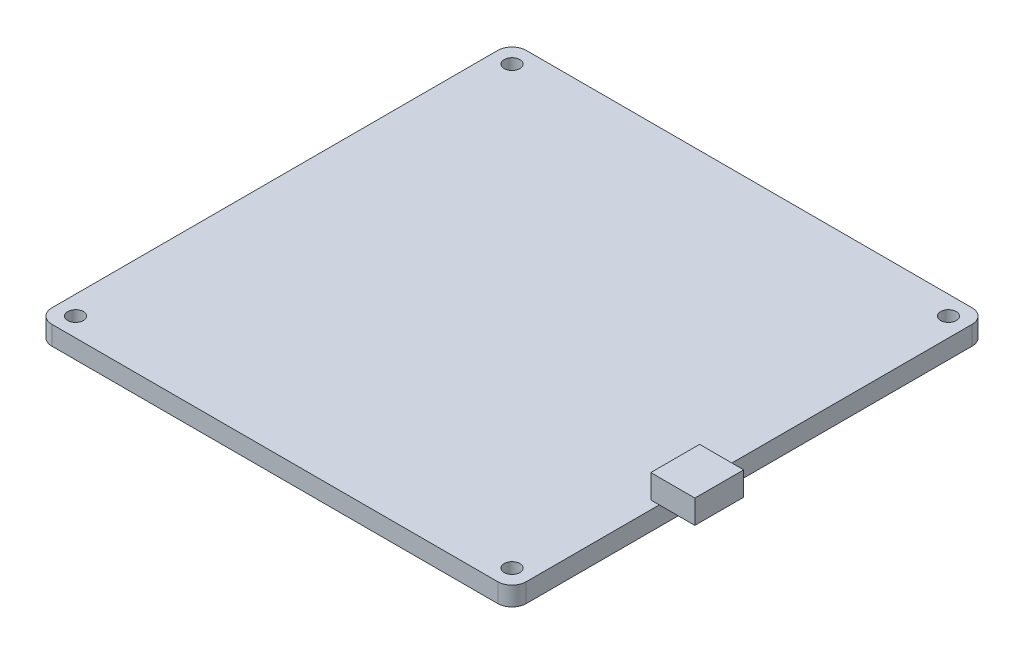
ISO-10303-21;
HEADER;
FILE_DESCRIPTION(('STEP AP214'),'2;1');
FILE_NAME('part.step','',(''),(''),'','','');
FILE_SCHEMA(('AUTOMOTIVE_DESIGN { 1 0 10303 214 1 1 1 1 }'));
ENDSEC;
DATA;
#1=APPLICATION_CONTEXT('core data for automotive mechanical design processes');
#2=APPLICATION_PROTOCOL_DEFINITION('international standard','automotive_design',2000,#1);
#3=PRODUCT_CONTEXT('',#1,'mechanical');
#4=PRODUCT('Part','Part','',(#3));
#5=PRODUCT_RELATED_PRODUCT_CATEGORY('part','',(#4));
#6=PRODUCT_DEFINITION_FORMATION('','',#4);
#7=PRODUCT_DEFINITION_CONTEXT('part definition',#1,'design');
#8=PRODUCT_DEFINITION('design','',#6,#7);
#9=PRODUCT_DEFINITION_SHAPE('','',#8);
#10=(LENGTH_UNIT() NAMED_UNIT(*) SI_UNIT(.MILLI.,.METRE.));
#11=(NAMED_UNIT(*) PLANE_ANGLE_UNIT() SI_UNIT($,.RADIAN.));
#12=(NAMED_UNIT(*) SI_UNIT($,.STERADIAN.) SOLID_ANGLE_UNIT());
#13=UNCERTAINTY_MEASURE_WITH_UNIT(LENGTH_MEASURE(1.E-05),#10,'distance_accuracy_value','');
#14=(GEOMETRIC_REPRESENTATION_CONTEXT(3) GLOBAL_UNCERTAINTY_ASSIGNED_CONTEXT((#13)) GLOBAL_UNIT_ASSIGNED_CONTEXT((#10,
#11,#12)) REPRESENTATION_CONTEXT('',''));
#15=CARTESIAN_POINT('',(0.,0.,0.));
#16=DIRECTION('',(0.,0.,1.));
#17=DIRECTION('',(1.,0.,0.));
#18=AXIS2_PLACEMENT_3D('',#15,#16,#17);
#19=CARTESIAN_POINT('',(0.,4.,0.));
#20=DIRECTION('',(0.,1.,0.));
#21=DIRECTION('',(0.,0.,1.));
#22=AXIS2_PLACEMENT_3D('',#19,#20,#21);
#23=PLANE('',#22);
#24=DIRECTION('',(1.,0.,0.));
#25=VECTOR('',#24,1.);
#26=CARTESIAN_POINT('',(48.2,4.,18.95));
#27=LINE('',#26,#25);
#28=CARTESIAN_POINT('',(48.2,4.,18.95));
#29=VERTEX_POINT('',#28);
#30=CARTESIAN_POINT('',(50.,4.,18.95));
#31=VERTEX_POINT('',#30);
#32=EDGE_CURVE('E58',#29,#31,#27,.T.);
#33=ORIENTED_EDGE('',*,*,#32,.F.);
#34=DIRECTION('',(0.,0.,1.));
#35=VECTOR('',#34,1.);
#36=CARTESIAN_POINT('',(48.2,4.,8.64999999999999));
#37=LINE('',#36,#35);
#38=CARTESIAN_POINT('',(48.2,4.,8.64999999999999));
#39=VERTEX_POINT('',#38);
#40=EDGE_CURVE('E284',#39,#29,#37,.T.);
#41=ORIENTED_EDGE('',*,*,#40,.F.);
#42=DIRECTION('',(-1.,0.,0.));
#43=VECTOR('',#42,1.);
#44=CARTESIAN_POINT('',(48.2,4.,8.64999999999999));
#45=LINE('',#44,#43);
#46=CARTESIAN_POINT('',(50.,4.,8.64999999999999));
#47=VERTEX_POINT('',#46);
#48=EDGE_CURVE('E11',#47,#39,#45,.T.);
#49=ORIENTED_EDGE('',*,*,#48,.F.);
#50=DIRECTION('',(0.,0.,-1.));
#51=VECTOR('',#50,1.);
#52=CARTESIAN_POINT('',(50.,4.,-50.));
#53=LINE('',#52,#51);
#54=CARTESIAN_POINT('',(50.,4.,-47.));
#55=VERTEX_POINT('',#54);
#56=EDGE_CURVE('E195',#47,#55,#53,.T.);
#57=ORIENTED_EDGE('',*,*,#56,.T.);
#58=CARTESIAN_POINT('',(47.,4.,-47.));
#59=DIRECTION('',(0.,1.,0.));
#60=DIRECTION('',(0.,0.,1.));
#61=AXIS2_PLACEMENT_3D('',#58,#59,#60);
#62=CIRCLE('',#61,3.);
#63=CARTESIAN_POINT('',(47.,4.,-50.));
#64=VERTEX_POINT('',#63);
#65=EDGE_CURVE('E240',#55,#64,#62,.T.);
#66=ORIENTED_EDGE('',*,*,#65,.T.);
#67=DIRECTION('',(-1.,0.,0.));
#68=VECTOR('',#67,1.);
#69=CARTESIAN_POINT('',(-50.,4.,-50.));
#70=LINE('',#69,#68);
#71=CARTESIAN_POINT('',(-47.,4.,-50.));
#72=VERTEX_POINT('',#71);
#73=EDGE_CURVE('E193',#64,#72,#70,.T.);
#74=ORIENTED_EDGE('',*,*,#73,.T.);
#75=CARTESIAN_POINT('',(-47.,4.,-47.));
#76=DIRECTION('',(0.,1.,0.));
#77=DIRECTION('',(0.,0.,1.));
#78=AXIS2_PLACEMENT_3D('',#75,#76,#77);
#79=CIRCLE('',#78,3.);
#80=CARTESIAN_POINT('',(-50.,4.,-47.));
#81=VERTEX_POINT('',#80);
#82=EDGE_CURVE('E234',#72,#81,#79,.T.);
#83=ORIENTED_EDGE('',*,*,#82,.T.);
#84=DIRECTION('',(0.,0.,1.));
#85=VECTOR('',#84,1.);
#86=CARTESIAN_POINT('',(-50.,4.,-50.));
#87=LINE('',#86,#85);
#88=CARTESIAN_POINT('',(-50.,4.,47.));
#89=VERTEX_POINT('',#88);
#90=EDGE_CURVE('E198',#81,#89,#87,.T.);
#91=ORIENTED_EDGE('',*,*,#90,.T.);
#92=CARTESIAN_POINT('',(-47.,4.,47.));
#93=DIRECTION('',(0.,1.,0.));
#94=DIRECTION('',(0.,0.,1.));
#95=AXIS2_PLACEMENT_3D('',#92,#93,#94);
#96=CIRCLE('',#95,3.);
#97=CARTESIAN_POINT('',(-47.,4.,50.));
#98=VERTEX_POINT('',#97);
#99=EDGE_CURVE('E236',#89,#98,#96,.T.);
#100=ORIENTED_EDGE('',*,*,#99,.T.);
#101=DIRECTION('',(1.,0.,0.));
#102=VECTOR('',#101,1.);
#103=CARTESIAN_POINT('',(-50.,4.,50.));
#104=LINE('',#103,#102);
#105=CARTESIAN_POINT('',(47.,4.,50.));
#106=VERTEX_POINT('',#105);
#107=EDGE_CURVE('E201',#98,#106,#104,.T.);
#108=ORIENTED_EDGE('',*,*,#107,.T.);
#109=CARTESIAN_POINT('',(47.,4.,47.));
#110=DIRECTION('',(0.,1.,0.));
#111=DIRECTION('',(0.,0.,1.));
#112=AXIS2_PLACEMENT_3D('',#109,#110,#111);
#113=CIRCLE('',#112,3.);
#114=CARTESIAN_POINT('',(50.,4.,47.));
#115=VERTEX_POINT('',#114);
#116=EDGE_CURVE('E238',#106,#115,#113,.T.);
#117=ORIENTED_EDGE('',*,*,#116,.T.);
#118=EDGE_CURVE('E191',#115,#31,#53,.T.);
#119=ORIENTED_EDGE('',*,*,#118,.T.);
#120=EDGE_LOOP('',(#33,#41,#49,#57,#66,#74,#83,#91,#100,#108,#117,#119));
#121=FACE_BOUND('',#120,.T.);
#122=CARTESIAN_POINT('',(45.9999999999997,4.,46.0000000000003));
#123=DIRECTION('',(0.,1.,0.));
#124=DIRECTION('',(0.,0.,1.));
#125=AXIS2_PLACEMENT_3D('',#122,#123,#124);
#126=CIRCLE('',#125,1.65000000000001);
#127=CARTESIAN_POINT('',(45.9999999999997,4.,47.6500000000003));
#128=VERTEX_POINT('',#127);
#129=EDGE_CURVE('E173',#128,#128,#126,.T.);
#130=ORIENTED_EDGE('',*,*,#129,.F.);
#131=EDGE_LOOP('',(#130));
#132=FACE_BOUND('',#131,.T.);
#133=CARTESIAN_POINT('',(-46.,4.,-46.));
#134=DIRECTION('',(0.,1.,0.));
#135=DIRECTION('',(0.,0.,1.));
#136=AXIS2_PLACEMENT_3D('',#133,#134,#135);
#137=CIRCLE('',#136,1.65);
#138=CARTESIAN_POINT('',(-46.,4.,-44.35));
#139=VERTEX_POINT('',#138);
#140=EDGE_CURVE('E185',#139,#139,#137,.T.);
#141=ORIENTED_EDGE('',*,*,#140,.F.);
#142=EDGE_LOOP('',(#141));
#143=FACE_BOUND('',#142,.T.);
#144=CARTESIAN_POINT('',(46.0000000000002,4.,-45.9999999999999));
#145=DIRECTION('',(0.,1.,0.));
#146=DIRECTION('',(0.,0.,1.));
#147=AXIS2_PLACEMENT_3D('',#144,#145,#146);
#148=CIRCLE('',#147,1.65);
#149=CARTESIAN_POINT('',(46.0000000000002,4.,-44.3499999999999));
#150=VERTEX_POINT('',#149);
#151=EDGE_CURVE('E179',#150,#150,#148,.T.);
#152=ORIENTED_EDGE('',*,*,#151,.F.);
#153=EDGE_LOOP('',(#152));
#154=FACE_BOUND('',#153,.T.);
#155=CARTESIAN_POINT('',(-46.0000000000005,4.,45.9999999999995));
#156=DIRECTION('',(0.,1.,0.));
#157=DIRECTION('',(0.,0.,1.));
#158=AXIS2_PLACEMENT_3D('',#155,#156,#157);
#159=CIRCLE('',#158,1.65);
#160=CARTESIAN_POINT('',(-46.0000000000005,4.,47.6499999999995));
#161=VERTEX_POINT('',#160);
#162=EDGE_CURVE('E164',#161,#161,#159,.T.);
#163=ORIENTED_EDGE('',*,*,#162,.F.);
#164=EDGE_LOOP('',(#163));
#165=FACE_BOUND('',#164,.T.);
#166=ADVANCED_FACE('F41',(#121,#132,#143,#154,#165),#23,.T.);
#167=CARTESIAN_POINT('',(0.,0.,0.));
#168=DIRECTION('',(0.,1.,0.));
#169=DIRECTION('',(0.,0.,1.));
#170=AXIS2_PLACEMENT_3D('',#167,#168,#169);
#171=PLANE('',#170);
#172=DIRECTION('',(-1.,0.,0.));
#173=VECTOR('',#172,1.);
#174=CARTESIAN_POINT('',(-50.,0.,-50.));
#175=LINE('',#174,#173);
#176=CARTESIAN_POINT('',(47.,0.,-50.));
#177=VERTEX_POINT('',#176);
#178=CARTESIAN_POINT('',(-47.,0.,-50.));
#179=VERTEX_POINT('',#178);
#180=EDGE_CURVE('E207',#177,#179,#175,.T.);
#181=ORIENTED_EDGE('',*,*,#180,.F.);
#182=CARTESIAN_POINT('',(47.,0.,-47.));
#183=DIRECTION('',(0.,1.,0.));
#184=DIRECTION('',(0.,0.,1.));
#185=AXIS2_PLACEMENT_3D('',#182,#183,#184);
#186=CIRCLE('',#185,3.);
#187=CARTESIAN_POINT('',(50.,0.,-47.));
#188=VERTEX_POINT('',#187);
#189=EDGE_CURVE('E226',#177,#188,#186,.F.);
#190=ORIENTED_EDGE('',*,*,#189,.T.);
#191=DIRECTION('',(0.,0.,-1.));
#192=VECTOR('',#191,1.);
#193=CARTESIAN_POINT('',(50.,0.,-50.));
#194=LINE('',#193,#192);
#195=CARTESIAN_POINT('',(50.,0.,47.));
#196=VERTEX_POINT('',#195);
#197=EDGE_CURVE('E188',#196,#188,#194,.T.);
#198=ORIENTED_EDGE('',*,*,#197,.F.);
#199=CARTESIAN_POINT('',(47.,0.,47.));
#200=DIRECTION('',(0.,1.,0.));
#201=DIRECTION('',(0.,0.,1.));
#202=AXIS2_PLACEMENT_3D('',#199,#200,#201);
#203=CIRCLE('',#202,3.);
#204=CARTESIAN_POINT('',(47.,0.,50.));
#205=VERTEX_POINT('',#204);
#206=EDGE_CURVE('E224',#196,#205,#203,.F.);
#207=ORIENTED_EDGE('',*,*,#206,.T.);
#208=DIRECTION('',(1.,0.,0.));
#209=VECTOR('',#208,1.);
#210=CARTESIAN_POINT('',(-50.,0.,50.));
#211=LINE('',#210,#209);
#212=CARTESIAN_POINT('',(-47.,0.,50.));
#213=VERTEX_POINT('',#212);
#214=EDGE_CURVE('E213',#213,#205,#211,.T.);
#215=ORIENTED_EDGE('',*,*,#214,.F.);
#216=CARTESIAN_POINT('',(-47.,0.,47.));
#217=DIRECTION('',(0.,1.,0.));
#218=DIRECTION('',(0.,0.,1.));
#219=AXIS2_PLACEMENT_3D('',#216,#217,#218);
#220=CIRCLE('',#219,3.);
#221=CARTESIAN_POINT('',(-50.,0.,47.));
#222=VERTEX_POINT('',#221);
#223=EDGE_CURVE('E222',#213,#222,#220,.F.);
#224=ORIENTED_EDGE('',*,*,#223,.T.);
#225=DIRECTION('',(0.,0.,1.));
#226=VECTOR('',#225,1.);
#227=CARTESIAN_POINT('',(-50.,0.,-50.));
#228=LINE('',#227,#226);
#229=CARTESIAN_POINT('',(-50.,0.,-47.));
#230=VERTEX_POINT('',#229);
#231=EDGE_CURVE('E210',#230,#222,#228,.T.);
#232=ORIENTED_EDGE('',*,*,#231,.F.);
#233=CARTESIAN_POINT('',(-47.,0.,-47.));
#234=DIRECTION('',(0.,1.,0.));
#235=DIRECTION('',(0.,0.,1.));
#236=AXIS2_PLACEMENT_3D('',#233,#234,#235);
#237=CIRCLE('',#236,3.);
#238=EDGE_CURVE('E220',#230,#179,#237,.F.);
#239=ORIENTED_EDGE('',*,*,#238,.T.);
#240=EDGE_LOOP('',(#181,#190,#198,#207,#215,#224,#232,#239));
#241=FACE_BOUND('',#240,.T.);
#242=CARTESIAN_POINT('',(-46.,0.,-46.));
#243=DIRECTION('',(0.,1.,0.));
#244=DIRECTION('',(0.,0.,1.));
#245=AXIS2_PLACEMENT_3D('',#242,#243,#244);
#246=CIRCLE('',#245,1.65);
#247=CARTESIAN_POINT('',(-46.,0.,-44.35));
#248=VERTEX_POINT('',#247);
#249=EDGE_CURVE('E182',#248,#248,#246,.T.);
#250=ORIENTED_EDGE('',*,*,#249,.T.);
#251=EDGE_LOOP('',(#250));
#252=FACE_BOUND('',#251,.T.);
#253=CARTESIAN_POINT('',(46.0000000000002,0.,-45.9999999999999));
#254=DIRECTION('',(0.,1.,0.));
#255=DIRECTION('',(0.,0.,1.));
#256=AXIS2_PLACEMENT_3D('',#253,#254,#255);
#257=CIRCLE('',#256,1.65);
#258=CARTESIAN_POINT('',(46.0000000000002,0.,-44.3499999999999));
#259=VERTEX_POINT('',#258);
#260=EDGE_CURVE('E176',#259,#259,#257,.T.);
#261=ORIENTED_EDGE('',*,*,#260,.T.);
#262=EDGE_LOOP('',(#261));
#263=FACE_BOUND('',#262,.T.);
#264=CARTESIAN_POINT('',(45.9999999999997,0.,46.0000000000003));
#265=DIRECTION('',(0.,1.,0.));
#266=DIRECTION('',(0.,0.,1.));
#267=AXIS2_PLACEMENT_3D('',#264,#265,#266);
#268=CIRCLE('',#267,1.65000000000001);
#269=CARTESIAN_POINT('',(45.9999999999997,0.,47.6500000000003));
#270=VERTEX_POINT('',#269);
#271=EDGE_CURVE('E171',#270,#270,#268,.T.);
#272=ORIENTED_EDGE('',*,*,#271,.T.);
#273=EDGE_LOOP('',(#272));
#274=FACE_BOUND('',#273,.T.);
#275=CARTESIAN_POINT('',(-46.0000000000005,0.,45.9999999999995));
#276=DIRECTION('',(0.,1.,0.));
#277=DIRECTION('',(0.,0.,1.));
#278=AXIS2_PLACEMENT_3D('',#275,#276,#277);
#279=CIRCLE('',#278,1.65);
#280=CARTESIAN_POINT('',(-46.0000000000005,0.,47.6499999999995));
#281=VERTEX_POINT('',#280);
#282=EDGE_CURVE('E161',#281,#281,#279,.T.);
#283=ORIENTED_EDGE('',*,*,#282,.T.);
#284=EDGE_LOOP('',(#283));
#285=FACE_BOUND('',#284,.T.);
#286=ADVANCED_FACE('F267',(#241,#252,#263,#274,#285),#171,.F.);
#287=CARTESIAN_POINT('',(50.,4.,-50.));
#288=DIRECTION('',(-1.,0.,0.));
#289=DIRECTION('',(0.,0.,1.));
#290=AXIS2_PLACEMENT_3D('',#287,#288,#289);
#291=PLANE('',#290);
#292=ORIENTED_EDGE('',*,*,#197,.T.);
#293=DIRECTION('',(0.,-1.,0.));
#294=VECTOR('',#293,1.);
#295=CARTESIAN_POINT('',(50.,4.,-47.));
#296=LINE('',#295,#294);
#297=EDGE_CURVE('E231',#188,#55,#296,.F.);
#298=ORIENTED_EDGE('',*,*,#297,.T.);
#299=ORIENTED_EDGE('',*,*,#56,.F.);
#300=EDGE_CURVE('E194',#31,#47,#53,.T.);
#301=ORIENTED_EDGE('',*,*,#300,.F.);
#302=ORIENTED_EDGE('',*,*,#118,.F.);
#303=DIRECTION('',(0.,-1.,0.));
#304=VECTOR('',#303,1.);
#305=CARTESIAN_POINT('',(50.,4.,47.));
#306=LINE('',#305,#304);
#307=EDGE_CURVE('E228',#115,#196,#306,.T.);
#308=ORIENTED_EDGE('',*,*,#307,.T.);
#309=EDGE_LOOP('',(#292,#298,#299,#301,#302,#308));
#310=FACE_BOUND('',#309,.T.);
#311=ADVANCED_FACE('F276',(#310),#291,.F.);
#312=CARTESIAN_POINT('',(-50.,4.,-50.));
#313=DIRECTION('',(0.,0.,1.));
#314=DIRECTION('',(1.,0.,0.));
#315=AXIS2_PLACEMENT_3D('',#312,#313,#314);
#316=PLANE('',#315);
#317=ORIENTED_EDGE('',*,*,#73,.F.);
#318=DIRECTION('',(0.,-1.,0.));
#319=VECTOR('',#318,1.);
#320=CARTESIAN_POINT('',(47.,4.,-50.));
#321=LINE('',#320,#319);
#322=EDGE_CURVE('E217',#64,#177,#321,.T.);
#323=ORIENTED_EDGE('',*,*,#322,.T.);
#324=ORIENTED_EDGE('',*,*,#180,.T.);
#325=DIRECTION('',(0.,-1.,0.));
#326=VECTOR('',#325,1.);
#327=CARTESIAN_POINT('',(-47.,4.,-50.));
#328=LINE('',#327,#326);
#329=EDGE_CURVE('E204',#179,#72,#328,.F.);
#330=ORIENTED_EDGE('',*,*,#329,.T.);
#331=EDGE_LOOP('',(#317,#323,#324,#330));
#332=FACE_BOUND('',#331,.T.);
#333=ADVANCED_FACE('F321',(#332),#316,.F.);
#334=CARTESIAN_POINT('',(-50.,4.,-50.));
#335=DIRECTION('',(1.,0.,0.));
#336=DIRECTION('',(0.,0.,-1.));
#337=AXIS2_PLACEMENT_3D('',#334,#335,#336);
#338=PLANE('',#337);
#339=ORIENTED_EDGE('',*,*,#231,.T.);
#340=DIRECTION('',(0.,-1.,0.));
#341=VECTOR('',#340,1.);
#342=CARTESIAN_POINT('',(-50.,4.,47.));
#343=LINE('',#342,#341);
#344=EDGE_CURVE('E45',#222,#89,#343,.F.);
#345=ORIENTED_EDGE('',*,*,#344,.T.);
#346=ORIENTED_EDGE('',*,*,#90,.F.);
#347=DIRECTION('',(0.,-1.,0.));
#348=VECTOR('',#347,1.);
#349=CARTESIAN_POINT('',(-50.,4.,-47.));
#350=LINE('',#349,#348);
#351=EDGE_CURVE('E246',#81,#230,#350,.T.);
#352=ORIENTED_EDGE('',*,*,#351,.T.);
#353=EDGE_LOOP('',(#339,#345,#346,#352));
#354=FACE_BOUND('',#353,.T.);
#355=ADVANCED_FACE('F253',(#354),#338,.F.);
#356=CARTESIAN_POINT('',(-50.,4.,50.));
#357=DIRECTION('',(0.,0.,-1.));
#358=DIRECTION('',(-1.,0.,0.));
#359=AXIS2_PLACEMENT_3D('',#356,#357,#358);
#360=PLANE('',#359);
#361=ORIENTED_EDGE('',*,*,#214,.T.);
#362=DIRECTION('',(0.,-1.,0.));
#363=VECTOR('',#362,1.);
#364=CARTESIAN_POINT('',(47.,4.,50.));
#365=LINE('',#364,#363);
#366=EDGE_CURVE('E245',#205,#106,#365,.F.);
#367=ORIENTED_EDGE('',*,*,#366,.T.);
#368=ORIENTED_EDGE('',*,*,#107,.F.);
#369=DIRECTION('',(0.,-1.,0.));
#370=VECTOR('',#369,1.);
#371=CARTESIAN_POINT('',(-47.,4.,50.));
#372=LINE('',#371,#370);
#373=EDGE_CURVE('E242',#98,#213,#372,.T.);
#374=ORIENTED_EDGE('',*,*,#373,.T.);
#375=EDGE_LOOP('',(#361,#367,#368,#374));
#376=FACE_BOUND('',#375,.T.);
#377=ADVANCED_FACE('F263',(#376),#360,.F.);
#378=CARTESIAN_POINT('',(-46.,4.,-46.));
#379=DIRECTION('',(0.,-1.,0.));
#380=DIRECTION('',(0.,0.,-1.));
#381=AXIS2_PLACEMENT_3D('',#378,#379,#380);
#382=CYLINDRICAL_SURFACE('',#381,1.65);
#383=ORIENTED_EDGE('',*,*,#140,.T.);
#384=EDGE_LOOP('',(#383));
#385=FACE_BOUND('',#384,.T.);
#386=ORIENTED_EDGE('',*,*,#249,.F.);
#387=EDGE_LOOP('',(#386));
#388=FACE_BOUND('',#387,.T.);
#389=ADVANCED_FACE('F314',(#385,#388),#382,.F.);
#390=CARTESIAN_POINT('',(46.0000000000002,4.,-45.9999999999999));
#391=DIRECTION('',(0.,-1.,0.));
#392=DIRECTION('',(0.,0.,-1.));
#393=AXIS2_PLACEMENT_3D('',#390,#391,#392);
#394=CYLINDRICAL_SURFACE('',#393,1.65);
#395=ORIENTED_EDGE('',*,*,#151,.T.);
#396=EDGE_LOOP('',(#395));
#397=FACE_BOUND('',#396,.T.);
#398=ORIENTED_EDGE('',*,*,#260,.F.);
#399=EDGE_LOOP('',(#398));
#400=FACE_BOUND('',#399,.T.);
#401=ADVANCED_FACE('F417',(#397,#400),#394,.F.);
#402=CARTESIAN_POINT('',(45.9999999999997,4.,46.0000000000003));
#403=DIRECTION('',(0.,-1.,0.));
#404=DIRECTION('',(0.,0.,-1.));
#405=AXIS2_PLACEMENT_3D('',#402,#403,#404);
#406=CYLINDRICAL_SURFACE('',#405,1.65000000000001);
#407=ORIENTED_EDGE('',*,*,#129,.T.);
#408=EDGE_LOOP('',(#407));
#409=FACE_BOUND('',#408,.T.);
#410=ORIENTED_EDGE('',*,*,#271,.F.);
#411=EDGE_LOOP('',(#410));
#412=FACE_BOUND('',#411,.T.);
#413=ADVANCED_FACE('F407',(#409,#412),#406,.F.);
#414=CARTESIAN_POINT('',(-46.0000000000005,4.,45.9999999999995));
#415=DIRECTION('',(0.,-1.,0.));
#416=DIRECTION('',(0.,0.,-1.));
#417=AXIS2_PLACEMENT_3D('',#414,#415,#416);
#418=CYLINDRICAL_SURFACE('',#417,1.65);
#419=ORIENTED_EDGE('',*,*,#162,.T.);
#420=EDGE_LOOP('',(#419));
#421=FACE_BOUND('',#420,.T.);
#422=ORIENTED_EDGE('',*,*,#282,.F.);
#423=EDGE_LOOP('',(#422));
#424=FACE_BOUND('',#423,.T.);
#425=ADVANCED_FACE('F329',(#421,#424),#418,.F.);
#426=CARTESIAN_POINT('',(47.,4.,-47.));
#427=DIRECTION('',(0.,-1.,0.));
#428=DIRECTION('',(0.,0.,-1.));
#429=AXIS2_PLACEMENT_3D('',#426,#427,#428);
#430=CYLINDRICAL_SURFACE('',#429,3.);
#431=ORIENTED_EDGE('',*,*,#65,.F.);
#432=ORIENTED_EDGE('',*,*,#297,.F.);
#433=ORIENTED_EDGE('',*,*,#189,.F.);
#434=ORIENTED_EDGE('',*,*,#322,.F.);
#435=EDGE_LOOP('',(#431,#432,#433,#434));
#436=FACE_BOUND('',#435,.T.);
#437=ADVANCED_FACE('F326',(#436),#430,.T.);
#438=CARTESIAN_POINT('',(47.,4.,47.));
#439=DIRECTION('',(0.,-1.,0.));
#440=DIRECTION('',(0.,0.,-1.));
#441=AXIS2_PLACEMENT_3D('',#438,#439,#440);
#442=CYLINDRICAL_SURFACE('',#441,3.);
#443=ORIENTED_EDGE('',*,*,#116,.F.);
#444=ORIENTED_EDGE('',*,*,#366,.F.);
#445=ORIENTED_EDGE('',*,*,#206,.F.);
#446=ORIENTED_EDGE('',*,*,#307,.F.);
#447=EDGE_LOOP('',(#443,#444,#445,#446));
#448=FACE_BOUND('',#447,.T.);
#449=ADVANCED_FACE('F273',(#448),#442,.T.);
#450=CARTESIAN_POINT('',(-47.,4.,47.));
#451=DIRECTION('',(0.,-1.,0.));
#452=DIRECTION('',(0.,0.,-1.));
#453=AXIS2_PLACEMENT_3D('',#450,#451,#452);
#454=CYLINDRICAL_SURFACE('',#453,3.);
#455=ORIENTED_EDGE('',*,*,#99,.F.);
#456=ORIENTED_EDGE('',*,*,#344,.F.);
#457=ORIENTED_EDGE('',*,*,#223,.F.);
#458=ORIENTED_EDGE('',*,*,#373,.F.);
#459=EDGE_LOOP('',(#455,#456,#457,#458));
#460=FACE_BOUND('',#459,.T.);
#461=ADVANCED_FACE('F260',(#460),#454,.T.);
#462=CARTESIAN_POINT('',(-47.,4.,-47.));
#463=DIRECTION('',(0.,-1.,0.));
#464=DIRECTION('',(0.,0.,-1.));
#465=AXIS2_PLACEMENT_3D('',#462,#463,#464);
#466=CYLINDRICAL_SURFACE('',#465,3.);
#467=ORIENTED_EDGE('',*,*,#82,.F.);
#468=ORIENTED_EDGE('',*,*,#329,.F.);
#469=ORIENTED_EDGE('',*,*,#238,.F.);
#470=ORIENTED_EDGE('',*,*,#351,.F.);
#471=EDGE_LOOP('',(#467,#468,#469,#470));
#472=FACE_BOUND('',#471,.T.);
#473=ADVANCED_FACE('F43',(#472),#466,.T.);
#474=CARTESIAN_POINT('',(0.,4.,0.));
#475=DIRECTION('',(0.,1.,0.));
#476=DIRECTION('',(0.,0.,1.));
#477=AXIS2_PLACEMENT_3D('',#474,#475,#476);
#478=PLANE('',#477);
#479=CARTESIAN_POINT('',(57.5,4.,18.95));
#480=VERTEX_POINT('',#479);
#481=EDGE_CURVE('E281',#31,#480,#27,.T.);
#482=ORIENTED_EDGE('',*,*,#481,.F.);
#483=ORIENTED_EDGE('',*,*,#300,.T.);
#484=CARTESIAN_POINT('',(57.5,4.,8.64999999999999));
#485=VERTEX_POINT('',#484);
#486=EDGE_CURVE('E51',#485,#47,#45,.T.);
#487=ORIENTED_EDGE('',*,*,#486,.F.);
#488=DIRECTION('',(0.,0.,-1.));
#489=VECTOR('',#488,1.);
#490=CARTESIAN_POINT('',(57.5,4.,8.64999999999999));
#491=LINE('',#490,#489);
#492=EDGE_CURVE('E160',#480,#485,#491,.T.);
#493=ORIENTED_EDGE('',*,*,#492,.F.);
#494=EDGE_LOOP('',(#482,#483,#487,#493));
#495=FACE_BOUND('',#494,.T.);
#496=ADVANCED_FACE('F282',(#495),#478,.F.);
#497=CARTESIAN_POINT('',(57.5,9.,8.64999999999999));
#498=DIRECTION('',(-1.,0.,0.));
#499=DIRECTION('',(0.,0.,1.));
#500=AXIS2_PLACEMENT_3D('',#497,#498,#499);
#501=PLANE('',#500);
#502=ORIENTED_EDGE('',*,*,#492,.T.);
#503=DIRECTION('',(0.,-1.,0.));
#504=VECTOR('',#503,1.);
#505=CARTESIAN_POINT('',(57.5,9.,8.64999999999999));
#506=LINE('',#505,#504);
#507=CARTESIAN_POINT('',(57.5,9.,8.64999999999999));
#508=VERTEX_POINT('',#507);
#509=EDGE_CURVE('E141',#508,#485,#506,.T.);
#510=ORIENTED_EDGE('',*,*,#509,.F.);
#511=DIRECTION('',(0.,0.,-1.));
#512=VECTOR('',#511,1.);
#513=CARTESIAN_POINT('',(57.5,9.,8.64999999999999));
#514=LINE('',#513,#512);
#515=CARTESIAN_POINT('',(57.5,9.,18.95));
#516=VERTEX_POINT('',#515);
#517=EDGE_CURVE('E148',#516,#508,#514,.T.);
#518=ORIENTED_EDGE('',*,*,#517,.F.);
#519=DIRECTION('',(0.,-1.,0.));
#520=VECTOR('',#519,1.);
#521=CARTESIAN_POINT('',(57.5,9.,18.95));
#522=LINE('',#521,#520);
#523=EDGE_CURVE('E291',#516,#480,#522,.T.);
#524=ORIENTED_EDGE('',*,*,#523,.T.);
#525=EDGE_LOOP('',(#502,#510,#518,#524));
#526=FACE_BOUND('',#525,.T.);
#527=ADVANCED_FACE('F158',(#526),#501,.F.);
#528=CARTESIAN_POINT('',(48.2,9.,8.64999999999999));
#529=DIRECTION('',(0.,0.,1.));
#530=DIRECTION('',(1.,0.,0.));
#531=AXIS2_PLACEMENT_3D('',#528,#529,#530);
#532=PLANE('',#531);
#533=ORIENTED_EDGE('',*,*,#486,.T.);
#534=ORIENTED_EDGE('',*,*,#48,.T.);
#535=DIRECTION('',(0.,-1.,0.));
#536=VECTOR('',#535,1.);
#537=CARTESIAN_POINT('',(48.2,9.,8.64999999999999));
#538=LINE('',#537,#536);
#539=CARTESIAN_POINT('',(48.2,9.,8.64999999999999));
#540=VERTEX_POINT('',#539);
#541=EDGE_CURVE('E144',#540,#39,#538,.T.);
#542=ORIENTED_EDGE('',*,*,#541,.F.);
#543=DIRECTION('',(-1.,0.,0.));
#544=VECTOR('',#543,1.);
#545=CARTESIAN_POINT('',(48.2,9.,8.64999999999999));
#546=LINE('',#545,#544);
#547=EDGE_CURVE('E136',#508,#540,#546,.T.);
#548=ORIENTED_EDGE('',*,*,#547,.F.);
#549=ORIENTED_EDGE('',*,*,#509,.T.);
#550=EDGE_LOOP('',(#533,#534,#542,#548,#549));
#551=FACE_BOUND('',#550,.T.);
#552=ADVANCED_FACE('F139',(#551),#532,.F.);
#553=CARTESIAN_POINT('',(48.2,9.,8.64999999999999));
#554=DIRECTION('',(1.,0.,0.));
#555=DIRECTION('',(0.,0.,-1.));
#556=AXIS2_PLACEMENT_3D('',#553,#554,#555);
#557=PLANE('',#556);
#558=ORIENTED_EDGE('',*,*,#40,.T.);
#559=DIRECTION('',(0.,-1.,0.));
#560=VECTOR('',#559,1.);
#561=CARTESIAN_POINT('',(48.2,9.,18.95));
#562=LINE('',#561,#560);
#563=CARTESIAN_POINT('',(48.2,9.,18.95));
#564=VERTEX_POINT('',#563);
#565=EDGE_CURVE('E166',#564,#29,#562,.T.);
#566=ORIENTED_EDGE('',*,*,#565,.F.);
#567=DIRECTION('',(0.,0.,1.));
#568=VECTOR('',#567,1.);
#569=CARTESIAN_POINT('',(48.2,9.,8.64999999999999));
#570=LINE('',#569,#568);
#571=EDGE_CURVE('E147',#540,#564,#570,.T.);
#572=ORIENTED_EDGE('',*,*,#571,.F.);
#573=ORIENTED_EDGE('',*,*,#541,.T.);
#574=EDGE_LOOP('',(#558,#566,#572,#573));
#575=FACE_BOUND('',#574,.T.);
#576=ADVANCED_FACE('F296',(#575),#557,.F.);
#577=CARTESIAN_POINT('',(48.2,9.,18.95));
#578=DIRECTION('',(0.,0.,-1.));
#579=DIRECTION('',(-1.,0.,0.));
#580=AXIS2_PLACEMENT_3D('',#577,#578,#579);
#581=PLANE('',#580);
#582=ORIENTED_EDGE('',*,*,#32,.T.);
#583=ORIENTED_EDGE('',*,*,#481,.T.);
#584=ORIENTED_EDGE('',*,*,#523,.F.);
#585=DIRECTION('',(1.,0.,0.));
#586=VECTOR('',#585,1.);
#587=CARTESIAN_POINT('',(48.2,9.,18.95));
#588=LINE('',#587,#586);
#589=EDGE_CURVE('E153',#564,#516,#588,.T.);
#590=ORIENTED_EDGE('',*,*,#589,.F.);
#591=ORIENTED_EDGE('',*,*,#565,.T.);
#592=EDGE_LOOP('',(#582,#583,#584,#590,#591));
#593=FACE_BOUND('',#592,.T.);
#594=ADVANCED_FACE('F287',(#593),#581,.F.);
#595=CARTESIAN_POINT('',(0.,9.,0.));
#596=DIRECTION('',(0.,1.,0.));
#597=DIRECTION('',(0.,0.,1.));
#598=AXIS2_PLACEMENT_3D('',#595,#596,#597);
#599=PLANE('',#598);
#600=ORIENTED_EDGE('',*,*,#517,.T.);
#601=ORIENTED_EDGE('',*,*,#547,.T.);
#602=ORIENTED_EDGE('',*,*,#571,.T.);
#603=ORIENTED_EDGE('',*,*,#589,.T.);
#604=EDGE_LOOP('',(#600,#601,#602,#603));
#605=FACE_BOUND('',#604,.T.);
#606=ADVANCED_FACE('F151',(#605),#599,.T.);
#607=CLOSED_SHELL('',(#166,#286,#311,#333,#355,#377,#389,#401,#413,#425,#437,#449,#461,#473,
#496,#527,#552,#576,#594,#606));
#608=MANIFOLD_SOLID_BREP('B2',#607);
#609=ADVANCED_BREP_SHAPE_REPRESENTATION('',(#18,#608),#14);
#610=SHAPE_DEFINITION_REPRESENTATION(#9,#609);
ENDSEC;
END-ISO-10303-21;
